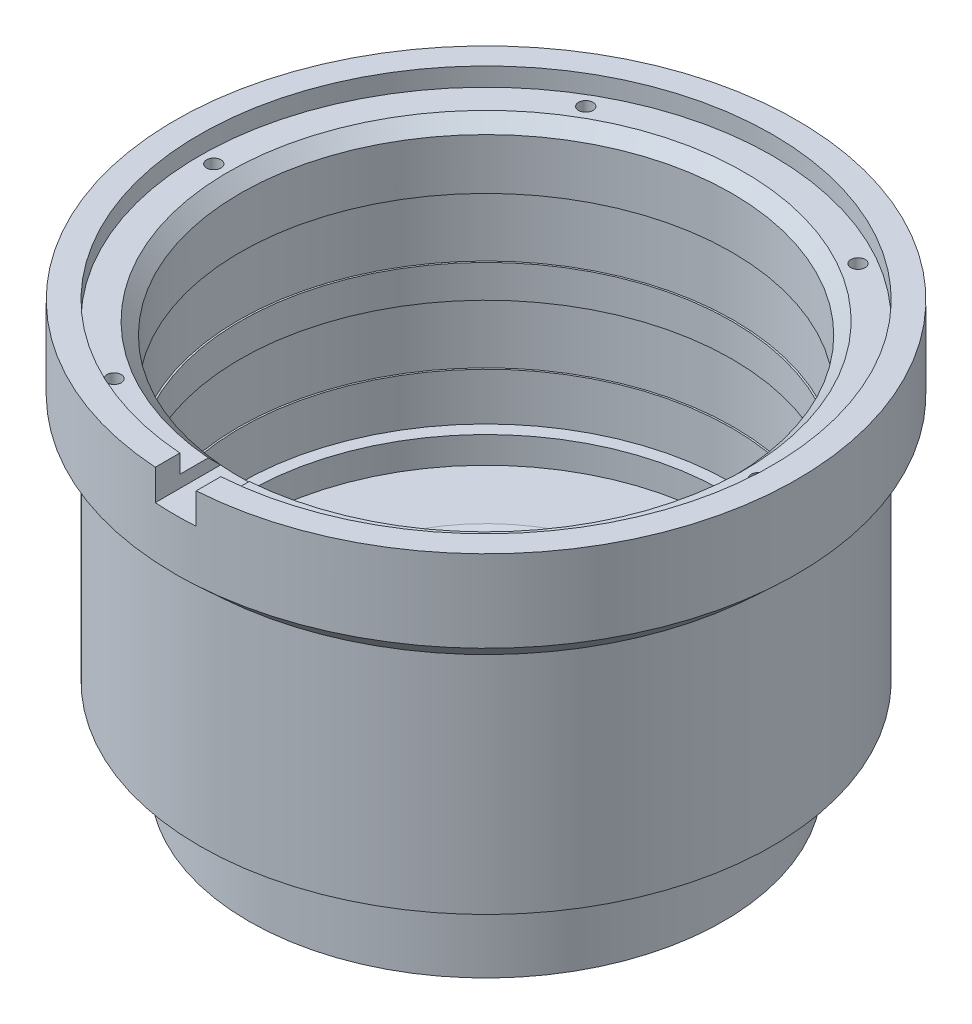
ISO-10303-21;
HEADER;
FILE_DESCRIPTION(('STEP AP214'),'2;1');
FILE_NAME('part.step','',(''),(''),'','','');
FILE_SCHEMA(('AUTOMOTIVE_DESIGN { 1 0 10303 214 1 1 1 1 }'));
ENDSEC;
DATA;
#1=APPLICATION_CONTEXT('core data for automotive mechanical design processes');
#2=APPLICATION_PROTOCOL_DEFINITION('international standard','automotive_design',2000,#1);
#3=PRODUCT_CONTEXT('',#1,'mechanical');
#4=PRODUCT('Part','Part','',(#3));
#5=PRODUCT_RELATED_PRODUCT_CATEGORY('part','',(#4));
#6=PRODUCT_DEFINITION_FORMATION('','',#4);
#7=PRODUCT_DEFINITION_CONTEXT('part definition',#1,'design');
#8=PRODUCT_DEFINITION('design','',#6,#7);
#9=PRODUCT_DEFINITION_SHAPE('','',#8);
#10=(LENGTH_UNIT() NAMED_UNIT(*) SI_UNIT(.MILLI.,.METRE.));
#11=(NAMED_UNIT(*) PLANE_ANGLE_UNIT() SI_UNIT($,.RADIAN.));
#12=(NAMED_UNIT(*) SI_UNIT($,.STERADIAN.) SOLID_ANGLE_UNIT());
#13=UNCERTAINTY_MEASURE_WITH_UNIT(LENGTH_MEASURE(1.E-05),#10,'distance_accuracy_value','');
#14=(GEOMETRIC_REPRESENTATION_CONTEXT(3) GLOBAL_UNCERTAINTY_ASSIGNED_CONTEXT((#13)) GLOBAL_UNIT_ASSIGNED_CONTEXT((#10,
#11,#12)) REPRESENTATION_CONTEXT('',''));
#15=CARTESIAN_POINT('',(0.,0.,0.));
#16=DIRECTION('',(0.,0.,1.));
#17=DIRECTION('',(1.,0.,0.));
#18=AXIS2_PLACEMENT_3D('',#15,#16,#17);
#19=CARTESIAN_POINT('',(0.,-30.2318711174091,0.));
#20=DIRECTION('',(0.,-1.,0.));
#21=DIRECTION('',(0.,0.,-1.));
#22=AXIS2_PLACEMENT_3D('',#19,#20,#21);
#23=CYLINDRICAL_SURFACE('',#22,30.0375);
#24=CARTESIAN_POINT('',(0.,34.31,0.));
#25=DIRECTION('',(0.,-1.,0.));
#26=DIRECTION('',(0.,0.,-1.));
#27=AXIS2_PLACEMENT_3D('',#24,#25,#26);
#28=CIRCLE('',#27,30.0375);
#29=CARTESIAN_POINT('',(-2.5,34.31,29.9332825839399));
#30=VERTEX_POINT('',#29);
#31=CARTESIAN_POINT('',(2.5,34.31,29.9332825839399));
#32=VERTEX_POINT('',#31);
#33=EDGE_CURVE('E113',#30,#32,#28,.F.);
#34=ORIENTED_EDGE('',*,*,#33,.T.);
#35=EDGE_CURVE('E120',#32,#30,#28,.F.);
#36=ORIENTED_EDGE('',*,*,#35,.T.);
#37=EDGE_LOOP('',(#34,#36));
#38=FACE_BOUND('',#37,.T.);
#39=CARTESIAN_POINT('',(0.,28.0847222222222,0.));
#40=DIRECTION('',(0.,-1.,0.));
#41=DIRECTION('',(0.,0.,-1.));
#42=AXIS2_PLACEMENT_3D('',#39,#40,#41);
#43=CIRCLE('',#42,30.0375);
#44=CARTESIAN_POINT('',(0.,28.0847222222222,-30.0375));
#45=VERTEX_POINT('',#44);
#46=EDGE_CURVE('E397',#45,#45,#43,.T.);
#47=ORIENTED_EDGE('',*,*,#46,.T.);
#48=EDGE_LOOP('',(#47));
#49=FACE_BOUND('',#48,.T.);
#50=ADVANCED_FACE('F42',(#38,#49),#23,.F.);
#51=CARTESIAN_POINT('',(0.,3.68801270189219,0.));
#52=DIRECTION('',(0.,-1.,0.));
#53=DIRECTION('',(0.,0.,-1.));
#54=AXIS2_PLACEMENT_3D('',#51,#52,#53);
#55=CIRCLE('',#54,30.0375);
#56=CARTESIAN_POINT('',(0.,3.68801270189219,-30.0375));
#57=VERTEX_POINT('',#56);
#58=EDGE_CURVE('E393',#57,#57,#55,.T.);
#59=ORIENTED_EDGE('',*,*,#58,.T.);
#60=EDGE_LOOP('',(#59));
#61=FACE_BOUND('',#60,.T.);
#62=CARTESIAN_POINT('',(0.,9.48027777777775,0.));
#63=DIRECTION('',(0.,-1.,0.));
#64=DIRECTION('',(0.,0.,-1.));
#65=AXIS2_PLACEMENT_3D('',#62,#63,#64);
#66=CIRCLE('',#65,30.0375);
#67=CARTESIAN_POINT('',(0.,9.48027777777775,-30.0375));
#68=VERTEX_POINT('',#67);
#69=EDGE_CURVE('E398',#68,#68,#66,.T.);
#70=ORIENTED_EDGE('',*,*,#69,.F.);
#71=EDGE_LOOP('',(#70));
#72=FACE_BOUND('',#71,.T.);
#73=ADVANCED_FACE('F169',(#61,#72),#23,.F.);
#74=CARTESIAN_POINT('',(-12.,-13.19,0.));
#75=DIRECTION('',(0.,1.,0.));
#76=DIRECTION('',(0.,0.,1.));
#77=AXIS2_PLACEMENT_3D('',#74,#75,#76);
#78=PLANE('',#77);
#79=CARTESIAN_POINT('',(0.,-13.19,0.));
#80=DIRECTION('',(0.,-1.,0.));
#81=DIRECTION('',(0.,0.,-1.));
#82=AXIS2_PLACEMENT_3D('',#79,#80,#81);
#83=CIRCLE('',#82,12.);
#84=CARTESIAN_POINT('',(0.,-13.19,-12.));
#85=VERTEX_POINT('',#84);
#86=EDGE_CURVE('E243',#85,#85,#83,.T.);
#87=ORIENTED_EDGE('',*,*,#86,.F.);
#88=EDGE_LOOP('',(#87));
#89=FACE_BOUND('',#88,.T.);
#90=CARTESIAN_POINT('',(-12.5,-13.19,21.650635094611));
#91=DIRECTION('',(0.,-1.,0.));
#92=DIRECTION('',(0.,0.,-1.));
#93=AXIS2_PLACEMENT_3D('',#90,#91,#92);
#94=CIRCLE('',#93,1.375);
#95=CARTESIAN_POINT('',(-12.5,-13.19,20.275635094611));
#96=VERTEX_POINT('',#95);
#97=EDGE_CURVE('E351',#96,#96,#94,.T.);
#98=ORIENTED_EDGE('',*,*,#97,.F.);
#99=EDGE_LOOP('',(#98));
#100=FACE_BOUND('',#99,.T.);
#101=CARTESIAN_POINT('',(12.5,-13.19,21.650635094611));
#102=DIRECTION('',(0.,-1.,0.));
#103=DIRECTION('',(0.,0.,-1.));
#104=AXIS2_PLACEMENT_3D('',#101,#102,#103);
#105=CIRCLE('',#104,1.375);
#106=CARTESIAN_POINT('',(12.5,-13.19,20.275635094611));
#107=VERTEX_POINT('',#106);
#108=EDGE_CURVE('E343',#107,#107,#105,.T.);
#109=ORIENTED_EDGE('',*,*,#108,.F.);
#110=EDGE_LOOP('',(#109));
#111=FACE_BOUND('',#110,.T.);
#112=CARTESIAN_POINT('',(25.,-13.19,0.));
#113=DIRECTION('',(0.,-1.,0.));
#114=DIRECTION('',(0.,0.,-1.));
#115=AXIS2_PLACEMENT_3D('',#112,#113,#114);
#116=CIRCLE('',#115,1.375);
#117=CARTESIAN_POINT('',(25.,-13.19,-1.375));
#118=VERTEX_POINT('',#117);
#119=EDGE_CURVE('E335',#118,#118,#116,.T.);
#120=ORIENTED_EDGE('',*,*,#119,.F.);
#121=EDGE_LOOP('',(#120));
#122=FACE_BOUND('',#121,.T.);
#123=CARTESIAN_POINT('',(12.5,-13.19,-21.650635094611));
#124=DIRECTION('',(0.,-1.,0.));
#125=DIRECTION('',(0.,0.,-1.));
#126=AXIS2_PLACEMENT_3D('',#123,#124,#125);
#127=CIRCLE('',#126,1.375);
#128=CARTESIAN_POINT('',(12.5,-13.19,-23.025635094611));
#129=VERTEX_POINT('',#128);
#130=EDGE_CURVE('E326',#129,#129,#127,.T.);
#131=ORIENTED_EDGE('',*,*,#130,.F.);
#132=EDGE_LOOP('',(#131));
#133=FACE_BOUND('',#132,.T.);
#134=CARTESIAN_POINT('',(-12.5,-13.19,-21.650635094611));
#135=DIRECTION('',(0.,-1.,0.));
#136=DIRECTION('',(0.,0.,-1.));
#137=AXIS2_PLACEMENT_3D('',#134,#135,#136);
#138=CIRCLE('',#137,1.375);
#139=CARTESIAN_POINT('',(-12.5,-13.19,-23.025635094611));
#140=VERTEX_POINT('',#139);
#141=EDGE_CURVE('E327',#140,#140,#138,.T.);
#142=ORIENTED_EDGE('',*,*,#141,.F.);
#143=EDGE_LOOP('',(#142));
#144=FACE_BOUND('',#143,.T.);
#145=CARTESIAN_POINT('',(-25.,-13.19,0.));
#146=DIRECTION('',(0.,-1.,0.));
#147=DIRECTION('',(0.,0.,-1.));
#148=AXIS2_PLACEMENT_3D('',#145,#146,#147);
#149=CIRCLE('',#148,1.375);
#150=CARTESIAN_POINT('',(-25.,-13.19,-1.375));
#151=VERTEX_POINT('',#150);
#152=EDGE_CURVE('E355',#151,#151,#149,.T.);
#153=ORIENTED_EDGE('',*,*,#152,.F.);
#154=EDGE_LOOP('',(#153));
#155=FACE_BOUND('',#154,.T.);
#156=CARTESIAN_POINT('',(0.,-13.19,0.));
#157=DIRECTION('',(0.,1.,0.));
#158=DIRECTION('',(0.,0.,1.));
#159=AXIS2_PLACEMENT_3D('',#156,#157,#158);
#160=CIRCLE('',#159,29.);
#161=CARTESIAN_POINT('',(0.,-13.19,29.));
#162=VERTEX_POINT('',#161);
#163=EDGE_CURVE('E360',#162,#162,#160,.T.);
#164=ORIENTED_EDGE('',*,*,#163,.F.);
#165=EDGE_LOOP('',(#164));
#166=FACE_BOUND('',#165,.T.);
#167=ADVANCED_FACE('F165',(#89,#100,#111,#122,#133,#144,#155,#166),#78,.F.);
#168=CARTESIAN_POINT('',(-38.,38.06,0.));
#169=DIRECTION('',(0.,-1.,0.));
#170=DIRECTION('',(0.,0.,-1.));
#171=AXIS2_PLACEMENT_3D('',#168,#169,#170);
#172=PLANE('',#171);
#173=CARTESIAN_POINT('',(0.,38.06,0.));
#174=DIRECTION('',(0.,-1.,0.));
#175=DIRECTION('',(0.,0.,-1.));
#176=AXIS2_PLACEMENT_3D('',#173,#174,#175);
#177=CIRCLE('',#176,35.);
#178=CARTESIAN_POINT('',(-2.5,38.06,34.9106001094224));
#179=VERTEX_POINT('',#178);
#180=CARTESIAN_POINT('',(2.5,38.06,34.9106001094224));
#181=VERTEX_POINT('',#180);
#182=EDGE_CURVE('E212',#179,#181,#177,.T.);
#183=ORIENTED_EDGE('',*,*,#182,.T.);
#184=DIRECTION('',(0.,0.,-1.));
#185=VECTOR('',#184,1.);
#186=CARTESIAN_POINT('',(2.5,38.06,38.));
#187=LINE('',#186,#185);
#188=CARTESIAN_POINT('',(2.5,38.06,37.9176739792936));
#189=VERTEX_POINT('',#188);
#190=EDGE_CURVE('E117',#189,#181,#187,.T.);
#191=ORIENTED_EDGE('',*,*,#190,.F.);
#192=CARTESIAN_POINT('',(0.,38.06,0.));
#193=DIRECTION('',(0.,-1.,0.));
#194=DIRECTION('',(0.,0.,-1.));
#195=AXIS2_PLACEMENT_3D('',#192,#193,#194);
#196=CIRCLE('',#195,38.);
#197=CARTESIAN_POINT('',(-2.5,38.06,37.9176739792936));
#198=VERTEX_POINT('',#197);
#199=EDGE_CURVE('E218',#198,#189,#196,.T.);
#200=ORIENTED_EDGE('',*,*,#199,.F.);
#201=DIRECTION('',(0.,0.,1.));
#202=VECTOR('',#201,1.);
#203=CARTESIAN_POINT('',(-2.5,38.06,38.));
#204=LINE('',#203,#202);
#205=EDGE_CURVE('E215',#179,#198,#204,.T.);
#206=ORIENTED_EDGE('',*,*,#205,.F.);
#207=EDGE_LOOP('',(#183,#191,#200,#206));
#208=FACE_BOUND('',#207,.T.);
#209=ADVANCED_FACE('F168',(#208),#172,.F.);
#210=CARTESIAN_POINT('',(0.,-30.2318711174091,0.));
#211=DIRECTION('',(0.,-1.,0.));
#212=DIRECTION('',(0.,0.,-1.));
#213=AXIS2_PLACEMENT_3D('',#210,#211,#212);
#214=CYLINDRICAL_SURFACE('',#213,35.);
#215=CARTESIAN_POINT('',(0.,35.81,0.));
#216=DIRECTION('',(0.,-1.,0.));
#217=DIRECTION('',(0.,0.,-1.));
#218=AXIS2_PLACEMENT_3D('',#215,#216,#217);
#219=CIRCLE('',#218,35.);
#220=CARTESIAN_POINT('',(-2.49999999999999,35.81,34.9106001094224));
#221=VERTEX_POINT('',#220);
#222=CARTESIAN_POINT('',(2.5,35.81,34.9106001094224));
#223=VERTEX_POINT('',#222);
#224=EDGE_CURVE('E219',#221,#223,#219,.T.);
#225=ORIENTED_EDGE('',*,*,#224,.T.);
#226=DIRECTION('',(0.,-1.,0.));
#227=VECTOR('',#226,1.);
#228=CARTESIAN_POINT('',(2.5,-30.2318711174091,34.9106001094224));
#229=LINE('',#228,#227);
#230=EDGE_CURVE('E72',#223,#181,#229,.F.);
#231=ORIENTED_EDGE('',*,*,#230,.T.);
#232=ORIENTED_EDGE('',*,*,#182,.F.);
#233=DIRECTION('',(0.,-1.,0.));
#234=VECTOR('',#233,1.);
#235=CARTESIAN_POINT('',(-2.49999999999999,-30.2318711174091,34.9106001094224));
#236=LINE('',#235,#234);
#237=EDGE_CURVE('E260',#179,#221,#236,.T.);
#238=ORIENTED_EDGE('',*,*,#237,.T.);
#239=EDGE_LOOP('',(#225,#231,#232,#238));
#240=FACE_BOUND('',#239,.T.);
#241=ADVANCED_FACE('F200',(#240),#214,.F.);
#242=CARTESIAN_POINT('',(-35.,35.81,0.));
#243=DIRECTION('',(0.,-1.,0.));
#244=DIRECTION('',(0.,0.,-1.));
#245=AXIS2_PLACEMENT_3D('',#242,#243,#244);
#246=PLANE('',#245);
#247=CARTESIAN_POINT('',(-33.26875,35.81,0.));
#248=DIRECTION('',(0.,1.,0.));
#249=DIRECTION('',(0.,0.,1.));
#250=AXIS2_PLACEMENT_3D('',#247,#248,#249);
#251=CIRCLE('',#250,0.874999999999998);
#252=CARTESIAN_POINT('',(-33.26875,35.81,0.874999999999999));
#253=VERTEX_POINT('',#252);
#254=EDGE_CURVE('E307',#253,#253,#251,.T.);
#255=ORIENTED_EDGE('',*,*,#254,.F.);
#256=EDGE_LOOP('',(#255));
#257=FACE_BOUND('',#256,.T.);
#258=CARTESIAN_POINT('',(-16.634375,35.81,28.8115826521536));
#259=DIRECTION('',(0.,1.,0.));
#260=DIRECTION('',(0.,0.,1.));
#261=AXIS2_PLACEMENT_3D('',#258,#259,#260);
#262=CIRCLE('',#261,0.875000000000002);
#263=CARTESIAN_POINT('',(-16.634375,35.81,29.6865826521536));
#264=VERTEX_POINT('',#263);
#265=EDGE_CURVE('E279',#264,#264,#262,.T.);
#266=ORIENTED_EDGE('',*,*,#265,.F.);
#267=EDGE_LOOP('',(#266));
#268=FACE_BOUND('',#267,.T.);
#269=CARTESIAN_POINT('',(16.634375,35.81,28.8115826521536));
#270=DIRECTION('',(0.,1.,0.));
#271=DIRECTION('',(0.,0.,1.));
#272=AXIS2_PLACEMENT_3D('',#269,#270,#271);
#273=CIRCLE('',#272,0.875000000000002);
#274=CARTESIAN_POINT('',(16.634375,35.81,29.6865826521536));
#275=VERTEX_POINT('',#274);
#276=EDGE_CURVE('E278',#275,#275,#273,.T.);
#277=ORIENTED_EDGE('',*,*,#276,.F.);
#278=EDGE_LOOP('',(#277));
#279=FACE_BOUND('',#278,.T.);
#280=CARTESIAN_POINT('',(33.26875,35.81,0.));
#281=DIRECTION('',(0.,1.,0.));
#282=DIRECTION('',(0.,0.,1.));
#283=AXIS2_PLACEMENT_3D('',#280,#281,#282);
#284=CIRCLE('',#283,0.874999999999998);
#285=CARTESIAN_POINT('',(33.26875,35.81,0.874999999999994));
#286=VERTEX_POINT('',#285);
#287=EDGE_CURVE('E287',#286,#286,#284,.T.);
#288=ORIENTED_EDGE('',*,*,#287,.F.);
#289=EDGE_LOOP('',(#288));
#290=FACE_BOUND('',#289,.T.);
#291=CARTESIAN_POINT('',(16.634375,35.81,-28.8115826521536));
#292=DIRECTION('',(0.,1.,0.));
#293=DIRECTION('',(0.,0.,1.));
#294=AXIS2_PLACEMENT_3D('',#291,#292,#293);
#295=CIRCLE('',#294,0.875000000000002);
#296=CARTESIAN_POINT('',(16.634375,35.81,-27.9365826521536));
#297=VERTEX_POINT('',#296);
#298=EDGE_CURVE('E295',#297,#297,#295,.T.);
#299=ORIENTED_EDGE('',*,*,#298,.F.);
#300=EDGE_LOOP('',(#299));
#301=FACE_BOUND('',#300,.T.);
#302=CARTESIAN_POINT('',(-16.634375,35.81,-28.8115826521536));
#303=DIRECTION('',(0.,1.,0.));
#304=DIRECTION('',(0.,0.,1.));
#305=AXIS2_PLACEMENT_3D('',#302,#303,#304);
#306=CIRCLE('',#305,0.875000000000002);
#307=CARTESIAN_POINT('',(-16.634375,35.81,-27.9365826521536));
#308=VERTEX_POINT('',#307);
#309=EDGE_CURVE('E303',#308,#308,#306,.T.);
#310=ORIENTED_EDGE('',*,*,#309,.F.);
#311=EDGE_LOOP('',(#310));
#312=FACE_BOUND('',#311,.T.);
#313=CARTESIAN_POINT('',(0.,35.81,0.));
#314=DIRECTION('',(0.,-1.,0.));
#315=DIRECTION('',(0.,0.,-1.));
#316=AXIS2_PLACEMENT_3D('',#313,#314,#315);
#317=CIRCLE('',#316,31.5375);
#318=CARTESIAN_POINT('',(-2.5,35.81,31.4382554581199));
#319=VERTEX_POINT('',#318);
#320=CARTESIAN_POINT('',(2.5,35.81,31.4382554581199));
#321=VERTEX_POINT('',#320);
#322=EDGE_CURVE('E124',#319,#321,#317,.T.);
#323=ORIENTED_EDGE('',*,*,#322,.T.);
#324=DIRECTION('',(0.,0.,1.));
#325=VECTOR('',#324,1.);
#326=CARTESIAN_POINT('',(2.49999999999999,35.81,0.));
#327=LINE('',#326,#325);
#328=EDGE_CURVE('E105',#321,#223,#327,.T.);
#329=ORIENTED_EDGE('',*,*,#328,.T.);
#330=ORIENTED_EDGE('',*,*,#224,.F.);
#331=DIRECTION('',(0.,0.,-1.));
#332=VECTOR('',#331,1.);
#333=CARTESIAN_POINT('',(-2.5,35.81,0.));
#334=LINE('',#333,#332);
#335=EDGE_CURVE('E263',#221,#319,#334,.T.);
#336=ORIENTED_EDGE('',*,*,#335,.T.);
#337=EDGE_LOOP('',(#323,#329,#330,#336));
#338=FACE_BOUND('',#337,.T.);
#339=ADVANCED_FACE('F193',(#257,#268,#279,#290,#301,#312,#338),#246,.F.);
#340=CARTESIAN_POINT('',(-30.0375,3.255,0.));
#341=DIRECTION('',(0.,-1.,0.));
#342=DIRECTION('',(0.,0.,-1.));
#343=AXIS2_PLACEMENT_3D('',#340,#341,#342);
#344=PLANE('',#343);
#345=CARTESIAN_POINT('',(0.,3.25500000000002,0.));
#346=DIRECTION('',(0.,-1.,0.));
#347=DIRECTION('',(0.,0.,-1.));
#348=AXIS2_PLACEMENT_3D('',#345,#346,#347);
#349=CIRCLE('',#348,29.0749999999999);
#350=CARTESIAN_POINT('',(0.,3.25500000000002,-29.0749999999999));
#351=VERTEX_POINT('',#350);
#352=EDGE_CURVE('E225',#351,#351,#349,.T.);
#353=ORIENTED_EDGE('',*,*,#352,.T.);
#354=EDGE_LOOP('',(#353));
#355=FACE_BOUND('',#354,.T.);
#356=CARTESIAN_POINT('',(0.,3.25499999999998,0.));
#357=DIRECTION('',(0.,-1.,0.));
#358=DIRECTION('',(0.,0.,-1.));
#359=AXIS2_PLACEMENT_3D('',#356,#357,#358);
#360=CIRCLE('',#359,30.7875);
#361=CARTESIAN_POINT('',(0.,3.25499999999998,-30.7875));
#362=VERTEX_POINT('',#361);
#363=EDGE_CURVE('E389',#362,#362,#360,.T.);
#364=ORIENTED_EDGE('',*,*,#363,.F.);
#365=EDGE_LOOP('',(#364));
#366=FACE_BOUND('',#365,.T.);
#367=ADVANCED_FACE('F189',(#355,#366),#344,.F.);
#368=CARTESIAN_POINT('',(0.,-30.2318711174091,0.));
#369=DIRECTION('',(0.,-1.,0.));
#370=DIRECTION('',(0.,0.,-1.));
#371=AXIS2_PLACEMENT_3D('',#368,#369,#370);
#372=CYLINDRICAL_SURFACE('',#371,29.0749999999999);
#373=ORIENTED_EDGE('',*,*,#352,.F.);
#374=EDGE_LOOP('',(#373));
#375=FACE_BOUND('',#374,.T.);
#376=CARTESIAN_POINT('',(0.,0.,0.));
#377=DIRECTION('',(0.,-1.,0.));
#378=DIRECTION('',(0.,0.,-1.));
#379=AXIS2_PLACEMENT_3D('',#376,#377,#378);
#380=CIRCLE('',#379,29.0749999999999);
#381=CARTESIAN_POINT('',(0.,0.,-29.0749999999999));
#382=VERTEX_POINT('',#381);
#383=EDGE_CURVE('E231',#382,#382,#380,.T.);
#384=ORIENTED_EDGE('',*,*,#383,.T.);
#385=EDGE_LOOP('',(#384));
#386=FACE_BOUND('',#385,.T.);
#387=ADVANCED_FACE('F185',(#375,#386),#372,.F.);
#388=CARTESIAN_POINT('',(-9.,0.,0.));
#389=DIRECTION('',(0.,-1.,0.));
#390=DIRECTION('',(0.,0.,-1.));
#391=AXIS2_PLACEMENT_3D('',#388,#389,#390);
#392=PLANE('',#391);
#393=CARTESIAN_POINT('',(0.,0.,0.));
#394=DIRECTION('',(0.,-1.,0.));
#395=DIRECTION('',(0.,0.,-1.));
#396=AXIS2_PLACEMENT_3D('',#393,#394,#395);
#397=CIRCLE('',#396,20.3425636392354);
#398=CARTESIAN_POINT('',(0.,0.,-20.3425636392354));
#399=VERTEX_POINT('',#398);
#400=EDGE_CURVE('E128',#399,#399,#397,.T.);
#401=ORIENTED_EDGE('',*,*,#400,.T.);
#402=EDGE_LOOP('',(#401));
#403=FACE_BOUND('',#402,.T.);
#404=ORIENTED_EDGE('',*,*,#383,.F.);
#405=EDGE_LOOP('',(#404));
#406=FACE_BOUND('',#405,.T.);
#407=ADVANCED_FACE('F181',(#403,#406),#392,.F.);
#408=CARTESIAN_POINT('',(0.,-30.2318711174091,0.));
#409=DIRECTION('',(0.,-1.,0.));
#410=DIRECTION('',(0.,0.,-1.));
#411=AXIS2_PLACEMENT_3D('',#408,#409,#410);
#412=CYLINDRICAL_SURFACE('',#411,9.);
#413=CARTESIAN_POINT('',(0.,-2.00000000000001,0.));
#414=DIRECTION('',(0.,-1.,0.));
#415=DIRECTION('',(0.,0.,-1.));
#416=AXIS2_PLACEMENT_3D('',#413,#414,#415);
#417=CIRCLE('',#416,9.);
#418=CARTESIAN_POINT('',(0.,-2.00000000000001,-9.));
#419=VERTEX_POINT('',#418);
#420=EDGE_CURVE('E132',#419,#419,#417,.F.);
#421=ORIENTED_EDGE('',*,*,#420,.T.);
#422=EDGE_LOOP('',(#421));
#423=FACE_BOUND('',#422,.T.);
#424=CARTESIAN_POINT('',(0.,-2.94,0.));
#425=DIRECTION('',(0.,-1.,0.));
#426=DIRECTION('',(0.,0.,-1.));
#427=AXIS2_PLACEMENT_3D('',#424,#425,#426);
#428=CIRCLE('',#427,9.);
#429=CARTESIAN_POINT('',(0.,-2.94,-9.));
#430=VERTEX_POINT('',#429);
#431=EDGE_CURVE('E235',#430,#430,#428,.T.);
#432=ORIENTED_EDGE('',*,*,#431,.T.);
#433=EDGE_LOOP('',(#432));
#434=FACE_BOUND('',#433,.T.);
#435=ADVANCED_FACE('F177',(#423,#434),#412,.F.);
#436=CARTESIAN_POINT('',(-9.,-2.94,0.));
#437=DIRECTION('',(0.,1.,0.));
#438=DIRECTION('',(0.,0.,1.));
#439=AXIS2_PLACEMENT_3D('',#436,#437,#438);
#440=PLANE('',#439);
#441=ORIENTED_EDGE('',*,*,#431,.F.);
#442=EDGE_LOOP('',(#441));
#443=FACE_BOUND('',#442,.T.);
#444=CARTESIAN_POINT('',(0.,-2.94,0.));
#445=DIRECTION('',(0.,-1.,0.));
#446=DIRECTION('',(0.,0.,-1.));
#447=AXIS2_PLACEMENT_3D('',#444,#445,#446);
#448=CIRCLE('',#447,12.);
#449=CARTESIAN_POINT('',(0.,-2.94,-12.));
#450=VERTEX_POINT('',#449);
#451=EDGE_CURVE('E239',#450,#450,#448,.T.);
#452=ORIENTED_EDGE('',*,*,#451,.T.);
#453=EDGE_LOOP('',(#452));
#454=FACE_BOUND('',#453,.T.);
#455=ADVANCED_FACE('F173',(#443,#454),#440,.F.);
#456=CARTESIAN_POINT('',(0.,-30.2318711174091,0.));
#457=DIRECTION('',(0.,-1.,0.));
#458=DIRECTION('',(0.,0.,-1.));
#459=AXIS2_PLACEMENT_3D('',#456,#457,#458);
#460=CYLINDRICAL_SURFACE('',#459,12.);
#461=ORIENTED_EDGE('',*,*,#451,.F.);
#462=EDGE_LOOP('',(#461));
#463=FACE_BOUND('',#462,.T.);
#464=ORIENTED_EDGE('',*,*,#86,.T.);
#465=EDGE_LOOP('',(#464));
#466=FACE_BOUND('',#465,.T.);
#467=ADVANCED_FACE('F163',(#463,#466),#460,.F.);
#468=CARTESIAN_POINT('',(0.,-30.2318711174091,0.));
#469=DIRECTION('',(0.,-1.,0.));
#470=DIRECTION('',(0.,0.,-1.));
#471=AXIS2_PLACEMENT_3D('',#468,#469,#470);
#472=CYLINDRICAL_SURFACE('',#471,38.);
#473=CARTESIAN_POINT('',(0.,28.06,0.));
#474=DIRECTION('',(0.,1.,0.));
#475=DIRECTION('',(0.,0.,1.));
#476=AXIS2_PLACEMENT_3D('',#473,#474,#475);
#477=CIRCLE('',#476,38.);
#478=CARTESIAN_POINT('',(0.,28.06,38.));
#479=VERTEX_POINT('',#478);
#480=EDGE_CURVE('E385',#479,#479,#477,.T.);
#481=ORIENTED_EDGE('',*,*,#480,.T.);
#482=EDGE_LOOP('',(#481));
#483=FACE_BOUND('',#482,.T.);
#484=ORIENTED_EDGE('',*,*,#199,.T.);
#485=DIRECTION('',(0.,-1.,0.));
#486=VECTOR('',#485,1.);
#487=CARTESIAN_POINT('',(2.5,-30.2318711174091,37.9176739792936));
#488=LINE('',#487,#486);
#489=CARTESIAN_POINT('',(2.5,34.31,37.9176739792936));
#490=VERTEX_POINT('',#489);
#491=EDGE_CURVE('E249',#189,#490,#488,.T.);
#492=ORIENTED_EDGE('',*,*,#491,.T.);
#493=CARTESIAN_POINT('',(0.,34.31,0.));
#494=DIRECTION('',(0.,-1.,0.));
#495=DIRECTION('',(0.,0.,-1.));
#496=AXIS2_PLACEMENT_3D('',#493,#494,#495);
#497=CIRCLE('',#496,38.);
#498=CARTESIAN_POINT('',(-2.5,34.31,37.9176739792936));
#499=VERTEX_POINT('',#498);
#500=EDGE_CURVE('E115',#490,#499,#497,.T.);
#501=ORIENTED_EDGE('',*,*,#500,.T.);
#502=DIRECTION('',(0.,-1.,0.));
#503=VECTOR('',#502,1.);
#504=CARTESIAN_POINT('',(-2.49999999999999,-30.2318711174091,37.9176739792936));
#505=LINE('',#504,#503);
#506=EDGE_CURVE('E256',#499,#198,#505,.F.);
#507=ORIENTED_EDGE('',*,*,#506,.T.);
#508=EDGE_LOOP('',(#484,#492,#501,#507));
#509=FACE_BOUND('',#508,.T.);
#510=ADVANCED_FACE('F160',(#483,#509),#472,.T.);
#511=CARTESIAN_POINT('',(0.,35.81,0.));
#512=DIRECTION('',(0.,1.,0.));
#513=DIRECTION('',(0.,0.,1.));
#514=AXIS2_PLACEMENT_3D('',#511,#512,#513);
#515=CONICAL_SURFACE('',#514,31.5375,0.785398163397446);
#516=CARTESIAN_POINT('',(2.5,38.0064498760366,33.6411856842019));
#517=CARTESIAN_POINT('',(2.5,37.5159165604655,33.1492992082921));
#518=CARTESIAN_POINT('',(2.5,37.0254123379568,32.6573837168513));
#519=CARTESIAN_POINT('',(2.5,36.0444718161019,31.6734850406488));
#520=CARTESIAN_POINT('',(2.5,35.5540355167539,31.1815018558888));
#521=CARTESIAN_POINT('',(2.5,34.5732405497735,30.197458102226));
#522=CARTESIAN_POINT('',(2.5,34.0828818821416,29.7053975333225));
#523=CARTESIAN_POINT('',(2.5,33.10225516573,28.7211860822988));
#524=CARTESIAN_POINT('',(2.5,32.6119871169527,28.2290352001761));
#525=CARTESIAN_POINT('',(2.5,32.1217708821292,27.7368327079033));
#526=B_SPLINE_CURVE_WITH_KNOTS('',3,(#516,#517,#518,#519,#520,#521,#522,#523,#524,#525),
.UNSPECIFIED.,.F.,.F.,(4,2,2,2,4),(0.,2.08402906775424,4.16805808201208,6.25208711029378,
8.33611619216076),.UNSPECIFIED.);
#527=EDGE_CURVE('E12',#321,#32,#526,.T.);
#528=ORIENTED_EDGE('',*,*,#527,.F.);
#529=ORIENTED_EDGE('',*,*,#322,.F.);
#530=CARTESIAN_POINT('',(-2.5,32.1217708821292,27.7368327079033));
#531=CARTESIAN_POINT('',(-2.5,32.6119871169527,28.2290352001761));
#532=CARTESIAN_POINT('',(-2.5,33.10225516573,28.7211860822988));
#533=CARTESIAN_POINT('',(-2.5,34.0828818821416,29.7053975333225));
#534=CARTESIAN_POINT('',(-2.5,34.5732405497735,30.197458102226));
#535=CARTESIAN_POINT('',(-2.5,35.5540355167539,31.1815018558888));
#536=CARTESIAN_POINT('',(-2.5,36.0444718161019,31.6734850406488));
#537=CARTESIAN_POINT('',(-2.5,37.0254123379568,32.6573837168513));
#538=CARTESIAN_POINT('',(-2.5,37.5159165604655,33.1492992082921));
#539=CARTESIAN_POINT('',(-2.5,38.0064498760366,33.6411856842019));
#540=B_SPLINE_CURVE_WITH_KNOTS('',3,(#530,#531,#532,#533,#534,#535,#536,#537,#538,#539),
.UNSPECIFIED.,.F.,.F.,(4,2,2,2,4),(0.,2.08402908186698,4.16805811014868,6.25208712440652,
8.33611619216076),.UNSPECIFIED.);
#541=EDGE_CURVE('E57',#30,#319,#540,.T.);
#542=ORIENTED_EDGE('',*,*,#541,.F.);
#543=ORIENTED_EDGE('',*,*,#35,.F.);
#544=EDGE_LOOP('',(#528,#529,#542,#543));
#545=FACE_BOUND('',#544,.T.);
#546=ADVANCED_FACE('F121',(#545),#515,.F.);
#547=CARTESIAN_POINT('',(0.,0.,0.));
#548=DIRECTION('',(0.,1.,0.));
#549=DIRECTION('',(0.,0.,1.));
#550=AXIS2_PLACEMENT_3D('',#547,#548,#549);
#551=CONICAL_SURFACE('',#550,20.3425636392354,1.39626340159546);
#552=ORIENTED_EDGE('',*,*,#420,.F.);
#553=EDGE_LOOP('',(#552));
#554=FACE_BOUND('',#553,.T.);
#555=ORIENTED_EDGE('',*,*,#400,.F.);
#556=EDGE_LOOP('',(#555));
#557=FACE_BOUND('',#556,.T.);
#558=ADVANCED_FACE('F45',(#554,#557),#551,.F.);
#559=CARTESIAN_POINT('',(0.,34.31,0.));
#560=DIRECTION('',(0.,-1.,0.));
#561=DIRECTION('',(0.,0.,-1.));
#562=AXIS2_PLACEMENT_3D('',#559,#560,#561);
#563=PLANE('',#562);
#564=DIRECTION('',(0.,0.,-1.));
#565=VECTOR('',#564,1.);
#566=CARTESIAN_POINT('',(2.5,34.31,38.));
#567=LINE('',#566,#565);
#568=EDGE_CURVE('E103',#490,#32,#567,.T.);
#569=ORIENTED_EDGE('',*,*,#568,.T.);
#570=ORIENTED_EDGE('',*,*,#33,.F.);
#571=DIRECTION('',(0.,0.,1.));
#572=VECTOR('',#571,1.);
#573=CARTESIAN_POINT('',(-2.5,34.31,38.));
#574=LINE('',#573,#572);
#575=EDGE_CURVE('E64',#30,#499,#574,.T.);
#576=ORIENTED_EDGE('',*,*,#575,.T.);
#577=ORIENTED_EDGE('',*,*,#500,.F.);
#578=EDGE_LOOP('',(#569,#570,#576,#577));
#579=FACE_BOUND('',#578,.T.);
#580=ADVANCED_FACE('F111',(#579),#563,.F.);
#581=CARTESIAN_POINT('',(2.5,24.8193767396146,38.));
#582=DIRECTION('',(1.,0.,0.));
#583=DIRECTION('',(0.,0.,-1.));
#584=AXIS2_PLACEMENT_3D('',#581,#582,#583);
#585=PLANE('',#584);
#586=ORIENTED_EDGE('',*,*,#190,.T.);
#587=ORIENTED_EDGE('',*,*,#230,.F.);
#588=ORIENTED_EDGE('',*,*,#328,.F.);
#589=ORIENTED_EDGE('',*,*,#527,.T.);
#590=ORIENTED_EDGE('',*,*,#568,.F.);
#591=ORIENTED_EDGE('',*,*,#491,.F.);
#592=EDGE_LOOP('',(#586,#587,#588,#589,#590,#591));
#593=FACE_BOUND('',#592,.T.);
#594=ADVANCED_FACE('F102',(#593),#585,.F.);
#595=CARTESIAN_POINT('',(-2.5,24.8193767396146,38.));
#596=DIRECTION('',(-1.,0.,0.));
#597=DIRECTION('',(0.,0.,1.));
#598=AXIS2_PLACEMENT_3D('',#595,#596,#597);
#599=PLANE('',#598);
#600=ORIENTED_EDGE('',*,*,#575,.F.);
#601=ORIENTED_EDGE('',*,*,#541,.T.);
#602=ORIENTED_EDGE('',*,*,#335,.F.);
#603=ORIENTED_EDGE('',*,*,#237,.F.);
#604=ORIENTED_EDGE('',*,*,#205,.T.);
#605=ORIENTED_EDGE('',*,*,#506,.F.);
#606=EDGE_LOOP('',(#600,#601,#602,#603,#604,#605));
#607=FACE_BOUND('',#606,.T.);
#608=ADVANCED_FACE('F148',(#607),#599,.F.);
#609=CARTESIAN_POINT('',(-16.634375,29.81,-28.8115826521536));
#610=DIRECTION('',(0.,1.,0.));
#611=DIRECTION('',(0.,0.,1.));
#612=AXIS2_PLACEMENT_3D('',#609,#610,#611);
#613=CYLINDRICAL_SURFACE('',#612,0.875000000000002);
#614=CARTESIAN_POINT('',(-16.634375,29.81,-28.8115826521536));
#615=DIRECTION('',(0.,1.,0.));
#616=DIRECTION('',(0.,0.,1.));
#617=AXIS2_PLACEMENT_3D('',#614,#615,#616);
#618=CIRCLE('',#617,0.875000000000002);
#619=CARTESIAN_POINT('',(-16.634375,29.81,-27.9365826521536));
#620=VERTEX_POINT('',#619);
#621=EDGE_CURVE('E299',#620,#620,#618,.T.);
#622=ORIENTED_EDGE('',*,*,#621,.F.);
#623=EDGE_LOOP('',(#622));
#624=FACE_BOUND('',#623,.T.);
#625=ORIENTED_EDGE('',*,*,#309,.T.);
#626=EDGE_LOOP('',(#625));
#627=FACE_BOUND('',#626,.T.);
#628=ADVANCED_FACE('F152',(#624,#627),#613,.F.);
#629=CARTESIAN_POINT('',(-16.634375,29.81,-28.8115826521536));
#630=DIRECTION('',(0.,1.,0.));
#631=DIRECTION('',(0.,0.,1.));
#632=AXIS2_PLACEMENT_3D('',#629,#630,#631);
#633=PLANE('',#632);
#634=ORIENTED_EDGE('',*,*,#621,.T.);
#635=EDGE_LOOP('',(#634));
#636=FACE_BOUND('',#635,.T.);
#637=ADVANCED_FACE('F560',(#636),#633,.T.);
#638=CARTESIAN_POINT('',(16.634375,29.81,-28.8115826521536));
#639=DIRECTION('',(0.,1.,0.));
#640=DIRECTION('',(0.,0.,1.));
#641=AXIS2_PLACEMENT_3D('',#638,#639,#640);
#642=CYLINDRICAL_SURFACE('',#641,0.875000000000002);
#643=CARTESIAN_POINT('',(16.634375,29.81,-28.8115826521536));
#644=DIRECTION('',(0.,1.,0.));
#645=DIRECTION('',(0.,0.,1.));
#646=AXIS2_PLACEMENT_3D('',#643,#644,#645);
#647=CIRCLE('',#646,0.875000000000002);
#648=CARTESIAN_POINT('',(16.634375,29.81,-27.9365826521536));
#649=VERTEX_POINT('',#648);
#650=EDGE_CURVE('E291',#649,#649,#647,.T.);
#651=ORIENTED_EDGE('',*,*,#650,.F.);
#652=EDGE_LOOP('',(#651));
#653=FACE_BOUND('',#652,.T.);
#654=ORIENTED_EDGE('',*,*,#298,.T.);
#655=EDGE_LOOP('',(#654));
#656=FACE_BOUND('',#655,.T.);
#657=ADVANCED_FACE('F564',(#653,#656),#642,.F.);
#658=CARTESIAN_POINT('',(16.634375,29.81,-28.8115826521536));
#659=DIRECTION('',(0.,1.,0.));
#660=DIRECTION('',(0.,0.,1.));
#661=AXIS2_PLACEMENT_3D('',#658,#659,#660);
#662=PLANE('',#661);
#663=ORIENTED_EDGE('',*,*,#650,.T.);
#664=EDGE_LOOP('',(#663));
#665=FACE_BOUND('',#664,.T.);
#666=ADVANCED_FACE('F568',(#665),#662,.T.);
#667=CARTESIAN_POINT('',(33.26875,29.81,0.));
#668=DIRECTION('',(0.,1.,0.));
#669=DIRECTION('',(0.,0.,1.));
#670=AXIS2_PLACEMENT_3D('',#667,#668,#669);
#671=CYLINDRICAL_SURFACE('',#670,0.874999999999998);
#672=CARTESIAN_POINT('',(33.26875,29.81,0.));
#673=DIRECTION('',(0.,1.,0.));
#674=DIRECTION('',(0.,0.,1.));
#675=AXIS2_PLACEMENT_3D('',#672,#673,#674);
#676=CIRCLE('',#675,0.874999999999998);
#677=CARTESIAN_POINT('',(33.26875,29.81,0.874999999999994));
#678=VERTEX_POINT('',#677);
#679=EDGE_CURVE('E283',#678,#678,#676,.T.);
#680=ORIENTED_EDGE('',*,*,#679,.F.);
#681=EDGE_LOOP('',(#680));
#682=FACE_BOUND('',#681,.T.);
#683=ORIENTED_EDGE('',*,*,#287,.T.);
#684=EDGE_LOOP('',(#683));
#685=FACE_BOUND('',#684,.T.);
#686=ADVANCED_FACE('F572',(#682,#685),#671,.F.);
#687=CARTESIAN_POINT('',(33.26875,29.81,0.));
#688=DIRECTION('',(0.,1.,0.));
#689=DIRECTION('',(0.,0.,1.));
#690=AXIS2_PLACEMENT_3D('',#687,#688,#689);
#691=PLANE('',#690);
#692=ORIENTED_EDGE('',*,*,#679,.T.);
#693=EDGE_LOOP('',(#692));
#694=FACE_BOUND('',#693,.T.);
#695=ADVANCED_FACE('F576',(#694),#691,.T.);
#696=CARTESIAN_POINT('',(16.634375,29.81,28.8115826521536));
#697=DIRECTION('',(0.,1.,0.));
#698=DIRECTION('',(0.,0.,1.));
#699=AXIS2_PLACEMENT_3D('',#696,#697,#698);
#700=CYLINDRICAL_SURFACE('',#699,0.875000000000002);
#701=CARTESIAN_POINT('',(16.634375,29.81,28.8115826521536));
#702=DIRECTION('',(0.,1.,0.));
#703=DIRECTION('',(0.,0.,1.));
#704=AXIS2_PLACEMENT_3D('',#701,#702,#703);
#705=CIRCLE('',#704,0.875000000000002);
#706=CARTESIAN_POINT('',(16.634375,29.81,29.6865826521536));
#707=VERTEX_POINT('',#706);
#708=EDGE_CURVE('E274',#707,#707,#705,.T.);
#709=ORIENTED_EDGE('',*,*,#708,.F.);
#710=EDGE_LOOP('',(#709));
#711=FACE_BOUND('',#710,.T.);
#712=ORIENTED_EDGE('',*,*,#276,.T.);
#713=EDGE_LOOP('',(#712));
#714=FACE_BOUND('',#713,.T.);
#715=ADVANCED_FACE('F579',(#711,#714),#700,.F.);
#716=CARTESIAN_POINT('',(16.634375,29.81,28.8115826521536));
#717=DIRECTION('',(0.,1.,0.));
#718=DIRECTION('',(0.,0.,1.));
#719=AXIS2_PLACEMENT_3D('',#716,#717,#718);
#720=PLANE('',#719);
#721=ORIENTED_EDGE('',*,*,#708,.T.);
#722=EDGE_LOOP('',(#721));
#723=FACE_BOUND('',#722,.T.);
#724=ADVANCED_FACE('F153',(#723),#720,.T.);
#725=CARTESIAN_POINT('',(-16.634375,29.81,28.8115826521536));
#726=DIRECTION('',(0.,1.,0.));
#727=DIRECTION('',(0.,0.,1.));
#728=AXIS2_PLACEMENT_3D('',#725,#726,#727);
#729=CYLINDRICAL_SURFACE('',#728,0.875000000000002);
#730=CARTESIAN_POINT('',(-16.634375,29.81,28.8115826521536));
#731=DIRECTION('',(0.,1.,0.));
#732=DIRECTION('',(0.,0.,1.));
#733=AXIS2_PLACEMENT_3D('',#730,#731,#732);
#734=CIRCLE('',#733,0.875000000000002);
#735=CARTESIAN_POINT('',(-16.634375,29.81,29.6865826521536));
#736=VERTEX_POINT('',#735);
#737=EDGE_CURVE('E308',#736,#736,#734,.T.);
#738=ORIENTED_EDGE('',*,*,#737,.F.);
#739=EDGE_LOOP('',(#738));
#740=FACE_BOUND('',#739,.T.);
#741=ORIENTED_EDGE('',*,*,#265,.T.);
#742=EDGE_LOOP('',(#741));
#743=FACE_BOUND('',#742,.T.);
#744=ADVANCED_FACE('F551',(#740,#743),#729,.F.);
#745=CARTESIAN_POINT('',(-16.634375,29.81,28.8115826521536));
#746=DIRECTION('',(0.,1.,0.));
#747=DIRECTION('',(0.,0.,1.));
#748=AXIS2_PLACEMENT_3D('',#745,#746,#747);
#749=PLANE('',#748);
#750=ORIENTED_EDGE('',*,*,#737,.T.);
#751=EDGE_LOOP('',(#750));
#752=FACE_BOUND('',#751,.T.);
#753=ADVANCED_FACE('F549',(#752),#749,.T.);
#754=CARTESIAN_POINT('',(-33.26875,29.81,0.));
#755=DIRECTION('',(0.,1.,0.));
#756=DIRECTION('',(0.,0.,1.));
#757=AXIS2_PLACEMENT_3D('',#754,#755,#756);
#758=CYLINDRICAL_SURFACE('',#757,0.874999999999998);
#759=CARTESIAN_POINT('',(-33.26875,29.81,0.));
#760=DIRECTION('',(0.,1.,0.));
#761=DIRECTION('',(0.,0.,1.));
#762=AXIS2_PLACEMENT_3D('',#759,#760,#761);
#763=CIRCLE('',#762,0.874999999999998);
#764=CARTESIAN_POINT('',(-33.26875,29.81,0.874999999999999));
#765=VERTEX_POINT('',#764);
#766=EDGE_CURVE('E271',#765,#765,#763,.T.);
#767=ORIENTED_EDGE('',*,*,#766,.F.);
#768=EDGE_LOOP('',(#767));
#769=FACE_BOUND('',#768,.T.);
#770=ORIENTED_EDGE('',*,*,#254,.T.);
#771=EDGE_LOOP('',(#770));
#772=FACE_BOUND('',#771,.T.);
#773=ADVANCED_FACE('F545',(#769,#772),#758,.F.);
#774=CARTESIAN_POINT('',(-33.26875,29.81,0.));
#775=DIRECTION('',(0.,1.,0.));
#776=DIRECTION('',(0.,0.,1.));
#777=AXIS2_PLACEMENT_3D('',#774,#775,#776);
#778=PLANE('',#777);
#779=ORIENTED_EDGE('',*,*,#766,.T.);
#780=EDGE_LOOP('',(#779));
#781=FACE_BOUND('',#780,.T.);
#782=ADVANCED_FACE('F515',(#781),#778,.T.);
#783=CARTESIAN_POINT('',(-12.5,-8.19000000000001,21.650635094611));
#784=DIRECTION('',(0.,-1.,0.));
#785=DIRECTION('',(0.,0.,-1.));
#786=AXIS2_PLACEMENT_3D('',#783,#784,#785);
#787=CYLINDRICAL_SURFACE('',#786,1.375);
#788=CARTESIAN_POINT('',(-12.5,-8.19000000000001,21.650635094611));
#789=DIRECTION('',(0.,-1.,0.));
#790=DIRECTION('',(0.,0.,-1.));
#791=AXIS2_PLACEMENT_3D('',#788,#789,#790);
#792=CIRCLE('',#791,1.375);
#793=CARTESIAN_POINT('',(-12.5,-8.19000000000001,20.275635094611));
#794=VERTEX_POINT('',#793);
#795=EDGE_CURVE('E347',#794,#794,#792,.T.);
#796=ORIENTED_EDGE('',*,*,#795,.F.);
#797=EDGE_LOOP('',(#796));
#798=FACE_BOUND('',#797,.T.);
#799=ORIENTED_EDGE('',*,*,#97,.T.);
#800=EDGE_LOOP('',(#799));
#801=FACE_BOUND('',#800,.T.);
#802=ADVANCED_FACE('F511',(#798,#801),#787,.F.);
#803=CARTESIAN_POINT('',(-12.5,-8.19000000000001,21.650635094611));
#804=DIRECTION('',(0.,-1.,0.));
#805=DIRECTION('',(0.,0.,-1.));
#806=AXIS2_PLACEMENT_3D('',#803,#804,#805);
#807=PLANE('',#806);
#808=ORIENTED_EDGE('',*,*,#795,.T.);
#809=EDGE_LOOP('',(#808));
#810=FACE_BOUND('',#809,.T.);
#811=ADVANCED_FACE('F514',(#810),#807,.T.);
#812=CARTESIAN_POINT('',(12.5,-8.19000000000001,21.650635094611));
#813=DIRECTION('',(0.,-1.,0.));
#814=DIRECTION('',(0.,0.,-1.));
#815=AXIS2_PLACEMENT_3D('',#812,#813,#814);
#816=CYLINDRICAL_SURFACE('',#815,1.375);
#817=CARTESIAN_POINT('',(12.5,-8.19000000000001,21.650635094611));
#818=DIRECTION('',(0.,-1.,0.));
#819=DIRECTION('',(0.,0.,-1.));
#820=AXIS2_PLACEMENT_3D('',#817,#818,#819);
#821=CIRCLE('',#820,1.375);
#822=CARTESIAN_POINT('',(12.5,-8.19000000000001,20.275635094611));
#823=VERTEX_POINT('',#822);
#824=EDGE_CURVE('E339',#823,#823,#821,.T.);
#825=ORIENTED_EDGE('',*,*,#824,.F.);
#826=EDGE_LOOP('',(#825));
#827=FACE_BOUND('',#826,.T.);
#828=ORIENTED_EDGE('',*,*,#108,.T.);
#829=EDGE_LOOP('',(#828));
#830=FACE_BOUND('',#829,.T.);
#831=ADVANCED_FACE('F519',(#827,#830),#816,.F.);
#832=CARTESIAN_POINT('',(12.5,-8.19000000000001,21.650635094611));
#833=DIRECTION('',(0.,-1.,0.));
#834=DIRECTION('',(0.,0.,-1.));
#835=AXIS2_PLACEMENT_3D('',#832,#833,#834);
#836=PLANE('',#835);
#837=ORIENTED_EDGE('',*,*,#824,.T.);
#838=EDGE_LOOP('',(#837));
#839=FACE_BOUND('',#838,.T.);
#840=ADVANCED_FACE('F523',(#839),#836,.T.);
#841=CARTESIAN_POINT('',(25.,-8.19000000000001,0.));
#842=DIRECTION('',(0.,-1.,0.));
#843=DIRECTION('',(0.,0.,-1.));
#844=AXIS2_PLACEMENT_3D('',#841,#842,#843);
#845=CYLINDRICAL_SURFACE('',#844,1.375);
#846=CARTESIAN_POINT('',(25.,-8.19000000000001,0.));
#847=DIRECTION('',(0.,-1.,0.));
#848=DIRECTION('',(0.,0.,-1.));
#849=AXIS2_PLACEMENT_3D('',#846,#847,#848);
#850=CIRCLE('',#849,1.375);
#851=CARTESIAN_POINT('',(25.,-8.19000000000001,-1.375));
#852=VERTEX_POINT('',#851);
#853=EDGE_CURVE('E331',#852,#852,#850,.T.);
#854=ORIENTED_EDGE('',*,*,#853,.F.);
#855=EDGE_LOOP('',(#854));
#856=FACE_BOUND('',#855,.T.);
#857=ORIENTED_EDGE('',*,*,#119,.T.);
#858=EDGE_LOOP('',(#857));
#859=FACE_BOUND('',#858,.T.);
#860=ADVANCED_FACE('F527',(#856,#859),#845,.F.);
#861=CARTESIAN_POINT('',(25.,-8.19000000000001,0.));
#862=DIRECTION('',(0.,-1.,0.));
#863=DIRECTION('',(0.,0.,-1.));
#864=AXIS2_PLACEMENT_3D('',#861,#862,#863);
#865=PLANE('',#864);
#866=ORIENTED_EDGE('',*,*,#853,.T.);
#867=EDGE_LOOP('',(#866));
#868=FACE_BOUND('',#867,.T.);
#869=ADVANCED_FACE('F531',(#868),#865,.T.);
#870=CARTESIAN_POINT('',(12.5,-8.19000000000001,-21.650635094611));
#871=DIRECTION('',(0.,-1.,0.));
#872=DIRECTION('',(0.,0.,-1.));
#873=AXIS2_PLACEMENT_3D('',#870,#871,#872);
#874=CYLINDRICAL_SURFACE('',#873,1.375);
#875=CARTESIAN_POINT('',(12.5,-8.19000000000001,-21.650635094611));
#876=DIRECTION('',(0.,-1.,0.));
#877=DIRECTION('',(0.,0.,-1.));
#878=AXIS2_PLACEMENT_3D('',#875,#876,#877);
#879=CIRCLE('',#878,1.375);
#880=CARTESIAN_POINT('',(12.5,-8.19000000000001,-23.025635094611));
#881=VERTEX_POINT('',#880);
#882=EDGE_CURVE('E322',#881,#881,#879,.T.);
#883=ORIENTED_EDGE('',*,*,#882,.F.);
#884=EDGE_LOOP('',(#883));
#885=FACE_BOUND('',#884,.T.);
#886=ORIENTED_EDGE('',*,*,#130,.T.);
#887=EDGE_LOOP('',(#886));
#888=FACE_BOUND('',#887,.T.);
#889=ADVANCED_FACE('F535',(#885,#888),#874,.F.);
#890=CARTESIAN_POINT('',(12.5,-8.19000000000001,-21.650635094611));
#891=DIRECTION('',(0.,-1.,0.));
#892=DIRECTION('',(0.,0.,-1.));
#893=AXIS2_PLACEMENT_3D('',#890,#891,#892);
#894=PLANE('',#893);
#895=ORIENTED_EDGE('',*,*,#882,.T.);
#896=EDGE_LOOP('',(#895));
#897=FACE_BOUND('',#896,.T.);
#898=ADVANCED_FACE('F506',(#897),#894,.T.);
#899=CARTESIAN_POINT('',(-12.5,-8.19000000000001,-21.650635094611));
#900=DIRECTION('',(0.,-1.,0.));
#901=DIRECTION('',(0.,0.,-1.));
#902=AXIS2_PLACEMENT_3D('',#899,#900,#901);
#903=CYLINDRICAL_SURFACE('',#902,1.375);
#904=CARTESIAN_POINT('',(-12.5,-8.19000000000001,-21.650635094611));
#905=DIRECTION('',(0.,-1.,0.));
#906=DIRECTION('',(0.,0.,-1.));
#907=AXIS2_PLACEMENT_3D('',#904,#905,#906);
#908=CIRCLE('',#907,1.375);
#909=CARTESIAN_POINT('',(-12.5,-8.19000000000001,-23.025635094611));
#910=VERTEX_POINT('',#909);
#911=EDGE_CURVE('E356',#910,#910,#908,.T.);
#912=ORIENTED_EDGE('',*,*,#911,.F.);
#913=EDGE_LOOP('',(#912));
#914=FACE_BOUND('',#913,.T.);
#915=ORIENTED_EDGE('',*,*,#141,.T.);
#916=EDGE_LOOP('',(#915));
#917=FACE_BOUND('',#916,.T.);
#918=ADVANCED_FACE('F503',(#914,#917),#903,.F.);
#919=CARTESIAN_POINT('',(-12.5,-8.19000000000001,-21.650635094611));
#920=DIRECTION('',(0.,-1.,0.));
#921=DIRECTION('',(0.,0.,-1.));
#922=AXIS2_PLACEMENT_3D('',#919,#920,#921);
#923=PLANE('',#922);
#924=ORIENTED_EDGE('',*,*,#911,.T.);
#925=EDGE_LOOP('',(#924));
#926=FACE_BOUND('',#925,.T.);
#927=ADVANCED_FACE('F501',(#926),#923,.T.);
#928=CARTESIAN_POINT('',(-25.,-8.19000000000001,0.));
#929=DIRECTION('',(0.,-1.,0.));
#930=DIRECTION('',(0.,0.,-1.));
#931=AXIS2_PLACEMENT_3D('',#928,#929,#930);
#932=CYLINDRICAL_SURFACE('',#931,1.375);
#933=CARTESIAN_POINT('',(-25.,-8.19000000000001,0.));
#934=DIRECTION('',(0.,-1.,0.));
#935=DIRECTION('',(0.,0.,-1.));
#936=AXIS2_PLACEMENT_3D('',#933,#934,#935);
#937=CIRCLE('',#936,1.375);
#938=CARTESIAN_POINT('',(-25.,-8.19000000000001,-1.375));
#939=VERTEX_POINT('',#938);
#940=EDGE_CURVE('E312',#939,#939,#937,.T.);
#941=ORIENTED_EDGE('',*,*,#940,.F.);
#942=EDGE_LOOP('',(#941));
#943=FACE_BOUND('',#942,.T.);
#944=ORIENTED_EDGE('',*,*,#152,.T.);
#945=EDGE_LOOP('',(#944));
#946=FACE_BOUND('',#945,.T.);
#947=ADVANCED_FACE('F497',(#943,#946),#932,.F.);
#948=CARTESIAN_POINT('',(-25.,-8.19000000000001,0.));
#949=DIRECTION('',(0.,-1.,0.));
#950=DIRECTION('',(0.,0.,-1.));
#951=AXIS2_PLACEMENT_3D('',#948,#949,#950);
#952=PLANE('',#951);
#953=ORIENTED_EDGE('',*,*,#940,.T.);
#954=EDGE_LOOP('',(#953));
#955=FACE_BOUND('',#954,.T.);
#956=ADVANCED_FACE('F493',(#955),#952,.T.);
#957=CARTESIAN_POINT('',(0.,0.,0.));
#958=DIRECTION('',(0.,1.,0.));
#959=DIRECTION('',(0.,0.,1.));
#960=AXIS2_PLACEMENT_3D('',#957,#958,#959);
#961=CYLINDRICAL_SURFACE('',#960,29.);
#962=CARTESIAN_POINT('',(0.,-5.69000000000001,0.));
#963=DIRECTION('',(0.,1.,0.));
#964=DIRECTION('',(0.,0.,1.));
#965=AXIS2_PLACEMENT_3D('',#962,#963,#964);
#966=CIRCLE('',#965,29.);
#967=CARTESIAN_POINT('',(0.,-5.69000000000001,29.));
#968=VERTEX_POINT('',#967);
#969=EDGE_CURVE('E373',#968,#968,#966,.T.);
#970=ORIENTED_EDGE('',*,*,#969,.F.);
#971=EDGE_LOOP('',(#970));
#972=FACE_BOUND('',#971,.T.);
#973=ORIENTED_EDGE('',*,*,#163,.T.);
#974=EDGE_LOOP('',(#973));
#975=FACE_BOUND('',#974,.T.);
#976=ADVANCED_FACE('F489',(#972,#975),#961,.T.);
#977=CARTESIAN_POINT('',(0.,-5.69000000000001,0.));
#978=DIRECTION('',(0.,1.,0.));
#979=DIRECTION('',(0.,0.,1.));
#980=AXIS2_PLACEMENT_3D('',#977,#978,#979);
#981=CONICAL_SURFACE('',#980,29.,1.0471975511966);
#982=CARTESIAN_POINT('',(0.,-2.22589838486225,0.));
#983=DIRECTION('',(0.,1.,0.));
#984=DIRECTION('',(0.,0.,1.));
#985=AXIS2_PLACEMENT_3D('',#982,#983,#984);
#986=CIRCLE('',#985,35.);
#987=CARTESIAN_POINT('',(0.,-2.22589838486225,35.));
#988=VERTEX_POINT('',#987);
#989=EDGE_CURVE('E377',#988,#988,#986,.T.);
#990=ORIENTED_EDGE('',*,*,#989,.F.);
#991=EDGE_LOOP('',(#990));
#992=FACE_BOUND('',#991,.T.);
#993=ORIENTED_EDGE('',*,*,#969,.T.);
#994=EDGE_LOOP('',(#993));
#995=FACE_BOUND('',#994,.T.);
#996=ADVANCED_FACE('F485',(#992,#995),#981,.T.);
#997=CARTESIAN_POINT('',(0.,0.,0.));
#998=DIRECTION('',(0.,1.,0.));
#999=DIRECTION('',(0.,0.,1.));
#1000=AXIS2_PLACEMENT_3D('',#997,#998,#999);
#1001=CYLINDRICAL_SURFACE('',#1000,35.);
#1002=CARTESIAN_POINT('',(0.,25.2741016151378,0.));
#1003=DIRECTION('',(0.,1.,0.));
#1004=DIRECTION('',(0.,0.,1.));
#1005=AXIS2_PLACEMENT_3D('',#1002,#1003,#1004);
#1006=CIRCLE('',#1005,35.);
#1007=CARTESIAN_POINT('',(0.,25.2741016151378,35.));
#1008=VERTEX_POINT('',#1007);
#1009=EDGE_CURVE('E381',#1008,#1008,#1006,.T.);
#1010=ORIENTED_EDGE('',*,*,#1009,.F.);
#1011=EDGE_LOOP('',(#1010));
#1012=FACE_BOUND('',#1011,.T.);
#1013=ORIENTED_EDGE('',*,*,#989,.T.);
#1014=EDGE_LOOP('',(#1013));
#1015=FACE_BOUND('',#1014,.T.);
#1016=ADVANCED_FACE('F481',(#1012,#1015),#1001,.T.);
#1017=CARTESIAN_POINT('',(0.,25.2741016151378,0.));
#1018=DIRECTION('',(0.,1.,0.));
#1019=DIRECTION('',(0.,0.,1.));
#1020=AXIS2_PLACEMENT_3D('',#1017,#1018,#1019);
#1021=CONICAL_SURFACE('',#1020,35.,0.822385327372843);
#1022=ORIENTED_EDGE('',*,*,#480,.F.);
#1023=EDGE_LOOP('',(#1022));
#1024=FACE_BOUND('',#1023,.T.);
#1025=ORIENTED_EDGE('',*,*,#1009,.T.);
#1026=EDGE_LOOP('',(#1025));
#1027=FACE_BOUND('',#1026,.T.);
#1028=ADVANCED_FACE('F477',(#1024,#1027),#1021,.T.);
#1029=CARTESIAN_POINT('',(0.,3.68801270189219,0.));
#1030=DIRECTION('',(0.,-1.,0.));
#1031=DIRECTION('',(0.,0.,-1.));
#1032=AXIS2_PLACEMENT_3D('',#1029,#1030,#1031);
#1033=CONICAL_SURFACE('',#1032,30.0375,1.0471975511966);
#1034=ORIENTED_EDGE('',*,*,#363,.T.);
#1035=EDGE_LOOP('',(#1034));
#1036=FACE_BOUND('',#1035,.T.);
#1037=ORIENTED_EDGE('',*,*,#58,.F.);
#1038=EDGE_LOOP('',(#1037));
#1039=FACE_BOUND('',#1038,.T.);
#1040=ADVANCED_FACE('F453',(#1036,#1039),#1033,.F.);
#1041=CARTESIAN_POINT('',(-30.0375,9.48027777777775,0.));
#1042=DIRECTION('',(0.,1.,0.));
#1043=DIRECTION('',(0.,0.,1.));
#1044=AXIS2_PLACEMENT_3D('',#1041,#1042,#1043);
#1045=PLANE('',#1044);
#1046=ORIENTED_EDGE('',*,*,#69,.T.);
#1047=EDGE_LOOP('',(#1046));
#1048=FACE_BOUND('',#1047,.T.);
#1049=CARTESIAN_POINT('',(0.,9.48027777777775,0.));
#1050=DIRECTION('',(0.,-1.,0.));
#1051=DIRECTION('',(0.,0.,-1.));
#1052=AXIS2_PLACEMENT_3D('',#1049,#1050,#1051);
#1053=CIRCLE('',#1052,30.2475);
#1054=CARTESIAN_POINT('',(0.,9.48027777777775,-30.2475));
#1055=VERTEX_POINT('',#1054);
#1056=EDGE_CURVE('E403',#1055,#1055,#1053,.T.);
#1057=ORIENTED_EDGE('',*,*,#1056,.F.);
#1058=EDGE_LOOP('',(#1057));
#1059=FACE_BOUND('',#1058,.T.);
#1060=ADVANCED_FACE('F449',(#1048,#1059),#1045,.T.);
#1061=CARTESIAN_POINT('',(0.,-10.4985879480175,0.));
#1062=DIRECTION('',(0.,-1.,0.));
#1063=DIRECTION('',(0.,0.,-1.));
#1064=AXIS2_PLACEMENT_3D('',#1061,#1062,#1063);
#1065=CYLINDRICAL_SURFACE('',#1064,30.2475);
#1066=ORIENTED_EDGE('',*,*,#1056,.T.);
#1067=EDGE_LOOP('',(#1066));
#1068=FACE_BOUND('',#1067,.T.);
#1069=CARTESIAN_POINT('',(0.,16.7825,0.));
#1070=DIRECTION('',(0.,-1.,0.));
#1071=DIRECTION('',(0.,0.,-1.));
#1072=AXIS2_PLACEMENT_3D('',#1069,#1070,#1071);
#1073=CIRCLE('',#1072,30.2475);
#1074=CARTESIAN_POINT('',(0.,16.7825,-30.2475));
#1075=VERTEX_POINT('',#1074);
#1076=EDGE_CURVE('E407',#1075,#1075,#1073,.T.);
#1077=ORIENTED_EDGE('',*,*,#1076,.F.);
#1078=EDGE_LOOP('',(#1077));
#1079=FACE_BOUND('',#1078,.T.);
#1080=ADVANCED_FACE('F452',(#1068,#1079),#1065,.F.);
#1081=CARTESIAN_POINT('',(-30.2475,16.7825,0.));
#1082=DIRECTION('',(0.,-1.,0.));
#1083=DIRECTION('',(0.,0.,-1.));
#1084=AXIS2_PLACEMENT_3D('',#1081,#1082,#1083);
#1085=PLANE('',#1084);
#1086=ORIENTED_EDGE('',*,*,#1076,.T.);
#1087=EDGE_LOOP('',(#1086));
#1088=FACE_BOUND('',#1087,.T.);
#1089=CARTESIAN_POINT('',(0.,16.7825,0.));
#1090=DIRECTION('',(0.,-1.,0.));
#1091=DIRECTION('',(0.,0.,-1.));
#1092=AXIS2_PLACEMENT_3D('',#1089,#1090,#1091);
#1093=CIRCLE('',#1092,30.0375);
#1094=CARTESIAN_POINT('',(0.,16.7825,-30.0375));
#1095=VERTEX_POINT('',#1094);
#1096=EDGE_CURVE('E411',#1095,#1095,#1093,.T.);
#1097=ORIENTED_EDGE('',*,*,#1096,.F.);
#1098=EDGE_LOOP('',(#1097));
#1099=FACE_BOUND('',#1098,.T.);
#1100=ADVANCED_FACE('F459',(#1088,#1099),#1085,.T.);
#1101=CARTESIAN_POINT('',(-30.0375,28.0847222222222,0.));
#1102=DIRECTION('',(0.,-1.,0.));
#1103=DIRECTION('',(0.,0.,-1.));
#1104=AXIS2_PLACEMENT_3D('',#1101,#1102,#1103);
#1105=PLANE('',#1104);
#1106=CARTESIAN_POINT('',(0.,28.0847222222222,0.));
#1107=DIRECTION('',(0.,-1.,0.));
#1108=DIRECTION('',(0.,0.,-1.));
#1109=AXIS2_PLACEMENT_3D('',#1106,#1107,#1108);
#1110=CIRCLE('',#1109,30.2475);
#1111=CARTESIAN_POINT('',(0.,28.0847222222222,-30.2475));
#1112=VERTEX_POINT('',#1111);
#1113=EDGE_CURVE('E418',#1112,#1112,#1110,.T.);
#1114=ORIENTED_EDGE('',*,*,#1113,.T.);
#1115=EDGE_LOOP('',(#1114));
#1116=FACE_BOUND('',#1115,.T.);
#1117=ORIENTED_EDGE('',*,*,#46,.F.);
#1118=EDGE_LOOP('',(#1117));
#1119=FACE_BOUND('',#1118,.T.);
#1120=ADVANCED_FACE('F465',(#1116,#1119),#1105,.T.);
#1121=CARTESIAN_POINT('',(0.,-10.4985879480175,0.));
#1122=DIRECTION('',(0.,-1.,0.));
#1123=DIRECTION('',(0.,0.,-1.));
#1124=AXIS2_PLACEMENT_3D('',#1121,#1122,#1123);
#1125=CYLINDRICAL_SURFACE('',#1124,30.2475);
#1126=CARTESIAN_POINT('',(0.,20.7825,0.));
#1127=DIRECTION('',(0.,-1.,0.));
#1128=DIRECTION('',(0.,0.,-1.));
#1129=AXIS2_PLACEMENT_3D('',#1126,#1127,#1128);
#1130=CIRCLE('',#1129,30.2475);
#1131=CARTESIAN_POINT('',(0.,20.7825,-30.2475));
#1132=VERTEX_POINT('',#1131);
#1133=EDGE_CURVE('E422',#1132,#1132,#1130,.T.);
#1134=ORIENTED_EDGE('',*,*,#1133,.T.);
#1135=EDGE_LOOP('',(#1134));
#1136=FACE_BOUND('',#1135,.T.);
#1137=ORIENTED_EDGE('',*,*,#1113,.F.);
#1138=EDGE_LOOP('',(#1137));
#1139=FACE_BOUND('',#1138,.T.);
#1140=ADVANCED_FACE('F439',(#1136,#1139),#1125,.F.);
#1141=CARTESIAN_POINT('',(-30.2475,20.7825,0.));
#1142=DIRECTION('',(0.,1.,0.));
#1143=DIRECTION('',(0.,0.,1.));
#1144=AXIS2_PLACEMENT_3D('',#1141,#1142,#1143);
#1145=PLANE('',#1144);
#1146=CARTESIAN_POINT('',(0.,20.7825,0.));
#1147=DIRECTION('',(0.,-1.,0.));
#1148=DIRECTION('',(0.,0.,-1.));
#1149=AXIS2_PLACEMENT_3D('',#1146,#1147,#1148);
#1150=CIRCLE('',#1149,30.0375);
#1151=CARTESIAN_POINT('',(0.,20.7825,-30.0375));
#1152=VERTEX_POINT('',#1151);
#1153=EDGE_CURVE('E402',#1152,#1152,#1150,.T.);
#1154=ORIENTED_EDGE('',*,*,#1153,.T.);
#1155=EDGE_LOOP('',(#1154));
#1156=FACE_BOUND('',#1155,.T.);
#1157=ORIENTED_EDGE('',*,*,#1133,.F.);
#1158=EDGE_LOOP('',(#1157));
#1159=FACE_BOUND('',#1158,.T.);
#1160=ADVANCED_FACE('F431',(#1156,#1159),#1145,.T.);
#1161=ORIENTED_EDGE('',*,*,#1096,.T.);
#1162=EDGE_LOOP('',(#1161));
#1163=FACE_BOUND('',#1162,.T.);
#1164=ORIENTED_EDGE('',*,*,#1153,.F.);
#1165=EDGE_LOOP('',(#1164));
#1166=FACE_BOUND('',#1165,.T.);
#1167=ADVANCED_FACE('F197',(#1163,#1166),#23,.F.);
#1168=CLOSED_SHELL('',(#50,#73,#167,#209,#241,#339,#367,#387,#407,#435,#455,#467,#510,#546,#558,
#580,#594,#608,#628,#637,#657,#666,#686,#695,#715,#724,#744,#753,#773,#782,#802,#811,#831,#840,
#860,#869,#889,#898,#918,#927,#947,#956,#976,#996,#1016,#1028,#1040,#1060,#1080,#1100,#1120,
#1140,#1160,#1167));
#1169=MANIFOLD_SOLID_BREP('B2',#1168);
#1170=ADVANCED_BREP_SHAPE_REPRESENTATION('',(#18,#1169),#14);
#1171=SHAPE_DEFINITION_REPRESENTATION(#9,#1170);
ENDSEC;
END-ISO-10303-21;
